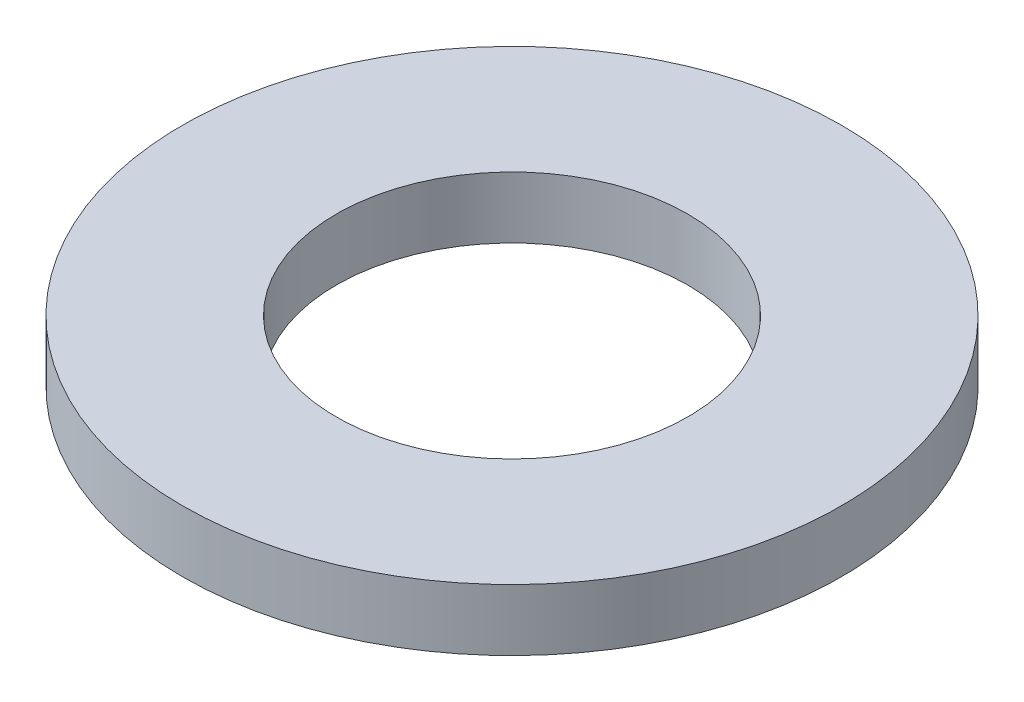
ISO-10303-21;
HEADER;
FILE_DESCRIPTION(('STEP AP214'),'2;1');
FILE_NAME('part.step','',(''),(''),'','','');
FILE_SCHEMA(('AUTOMOTIVE_DESIGN { 1 0 10303 214 1 1 1 1 }'));
ENDSEC;
DATA;
#1=APPLICATION_CONTEXT('core data for automotive mechanical design processes');
#2=APPLICATION_PROTOCOL_DEFINITION('international standard','automotive_design',2000,#1);
#3=PRODUCT_CONTEXT('',#1,'mechanical');
#4=PRODUCT('Part','Part','',(#3));
#5=PRODUCT_RELATED_PRODUCT_CATEGORY('part','',(#4));
#6=PRODUCT_DEFINITION_FORMATION('','',#4);
#7=PRODUCT_DEFINITION_CONTEXT('part definition',#1,'design');
#8=PRODUCT_DEFINITION('design','',#6,#7);
#9=PRODUCT_DEFINITION_SHAPE('','',#8);
#10=(LENGTH_UNIT() NAMED_UNIT(*) SI_UNIT(.MILLI.,.METRE.));
#11=(NAMED_UNIT(*) PLANE_ANGLE_UNIT() SI_UNIT($,.RADIAN.));
#12=(NAMED_UNIT(*) SI_UNIT($,.STERADIAN.) SOLID_ANGLE_UNIT());
#13=UNCERTAINTY_MEASURE_WITH_UNIT(LENGTH_MEASURE(1.E-05),#10,'distance_accuracy_value','');
#14=(GEOMETRIC_REPRESENTATION_CONTEXT(3) GLOBAL_UNCERTAINTY_ASSIGNED_CONTEXT((#13)) GLOBAL_UNIT_ASSIGNED_CONTEXT((#10,
#11,#12)) REPRESENTATION_CONTEXT('',''));
#15=CARTESIAN_POINT('',(0.,0.,0.));
#16=DIRECTION('',(0.,0.,1.));
#17=DIRECTION('',(1.,0.,0.));
#18=AXIS2_PLACEMENT_3D('',#15,#16,#17);
#19=CARTESIAN_POINT('',(0.,1.4,0.));
#20=DIRECTION('',(0.,1.,0.));
#21=DIRECTION('',(0.,0.,-1.));
#22=AXIS2_PLACEMENT_3D('',#19,#20,#21);
#23=PLANE('',#22);
#24=CARTESIAN_POINT('',(0.,1.4,0.));
#25=DIRECTION('',(0.,-1.,0.));
#26=DIRECTION('',(0.,0.,-1.));
#27=AXIS2_PLACEMENT_3D('',#24,#25,#26);
#28=CIRCLE('',#27,7.5);
#29=CARTESIAN_POINT('',(0.,1.4,-7.5));
#30=VERTEX_POINT('',#29);
#31=EDGE_CURVE('E10',#30,#30,#28,.T.);
#32=ORIENTED_EDGE('',*,*,#31,.F.);
#33=EDGE_LOOP('',(#32));
#34=FACE_BOUND('',#33,.T.);
#35=CARTESIAN_POINT('',(0.,1.4,0.));
#36=DIRECTION('',(0.,-1.,0.));
#37=DIRECTION('',(0.,0.,-1.));
#38=AXIS2_PLACEMENT_3D('',#35,#36,#37);
#39=CIRCLE('',#38,4.);
#40=CARTESIAN_POINT('',(0.,1.4,-4.));
#41=VERTEX_POINT('',#40);
#42=EDGE_CURVE('E50',#41,#41,#39,.T.);
#43=ORIENTED_EDGE('',*,*,#42,.T.);
#44=EDGE_LOOP('',(#43));
#45=FACE_BOUND('',#44,.T.);
#46=ADVANCED_FACE('F39',(#34,#45),#23,.T.);
#47=CARTESIAN_POINT('',(0.,0.,0.));
#48=DIRECTION('',(0.,1.,0.));
#49=DIRECTION('',(0.,0.,-1.));
#50=AXIS2_PLACEMENT_3D('',#47,#48,#49);
#51=PLANE('',#50);
#52=CARTESIAN_POINT('',(0.,0.,0.));
#53=DIRECTION('',(0.,-1.,0.));
#54=DIRECTION('',(0.,0.,-1.));
#55=AXIS2_PLACEMENT_3D('',#52,#53,#54);
#56=CIRCLE('',#55,7.5);
#57=CARTESIAN_POINT('',(0.,0.,-7.5));
#58=VERTEX_POINT('',#57);
#59=EDGE_CURVE('E43',#58,#58,#56,.T.);
#60=ORIENTED_EDGE('',*,*,#59,.T.);
#61=EDGE_LOOP('',(#60));
#62=FACE_BOUND('',#61,.T.);
#63=CARTESIAN_POINT('',(0.,0.,0.));
#64=DIRECTION('',(0.,-1.,0.));
#65=DIRECTION('',(0.,0.,-1.));
#66=AXIS2_PLACEMENT_3D('',#63,#64,#65);
#67=CIRCLE('',#66,4.);
#68=CARTESIAN_POINT('',(0.,0.,-4.));
#69=VERTEX_POINT('',#68);
#70=EDGE_CURVE('E52',#69,#69,#67,.T.);
#71=ORIENTED_EDGE('',*,*,#70,.F.);
#72=EDGE_LOOP('',(#71));
#73=FACE_BOUND('',#72,.T.);
#74=ADVANCED_FACE('F65',(#62,#73),#51,.F.);
#75=CARTESIAN_POINT('',(0.,1.4,0.));
#76=DIRECTION('',(0.,-1.,0.));
#77=DIRECTION('',(0.,0.,1.));
#78=AXIS2_PLACEMENT_3D('',#75,#76,#77);
#79=CYLINDRICAL_SURFACE('',#78,7.5);
#80=ORIENTED_EDGE('',*,*,#31,.T.);
#81=EDGE_LOOP('',(#80));
#82=FACE_BOUND('',#81,.T.);
#83=ORIENTED_EDGE('',*,*,#59,.F.);
#84=EDGE_LOOP('',(#83));
#85=FACE_BOUND('',#84,.T.);
#86=ADVANCED_FACE('F41',(#82,#85),#79,.T.);
#87=CARTESIAN_POINT('',(0.,1.4,0.));
#88=DIRECTION('',(0.,-1.,0.));
#89=DIRECTION('',(0.,0.,1.));
#90=AXIS2_PLACEMENT_3D('',#87,#88,#89);
#91=CYLINDRICAL_SURFACE('',#90,4.);
#92=ORIENTED_EDGE('',*,*,#42,.F.);
#93=EDGE_LOOP('',(#92));
#94=FACE_BOUND('',#93,.T.);
#95=ORIENTED_EDGE('',*,*,#70,.T.);
#96=EDGE_LOOP('',(#95));
#97=FACE_BOUND('',#96,.T.);
#98=ADVANCED_FACE('F59',(#94,#97),#91,.F.);
#99=CLOSED_SHELL('',(#46,#74,#86,#98));
#100=MANIFOLD_SOLID_BREP('B2',#99);
#101=ADVANCED_BREP_SHAPE_REPRESENTATION('',(#18,#100),#14);
#102=SHAPE_DEFINITION_REPRESENTATION(#9,#101);
ENDSEC;
END-ISO-10303-21;
